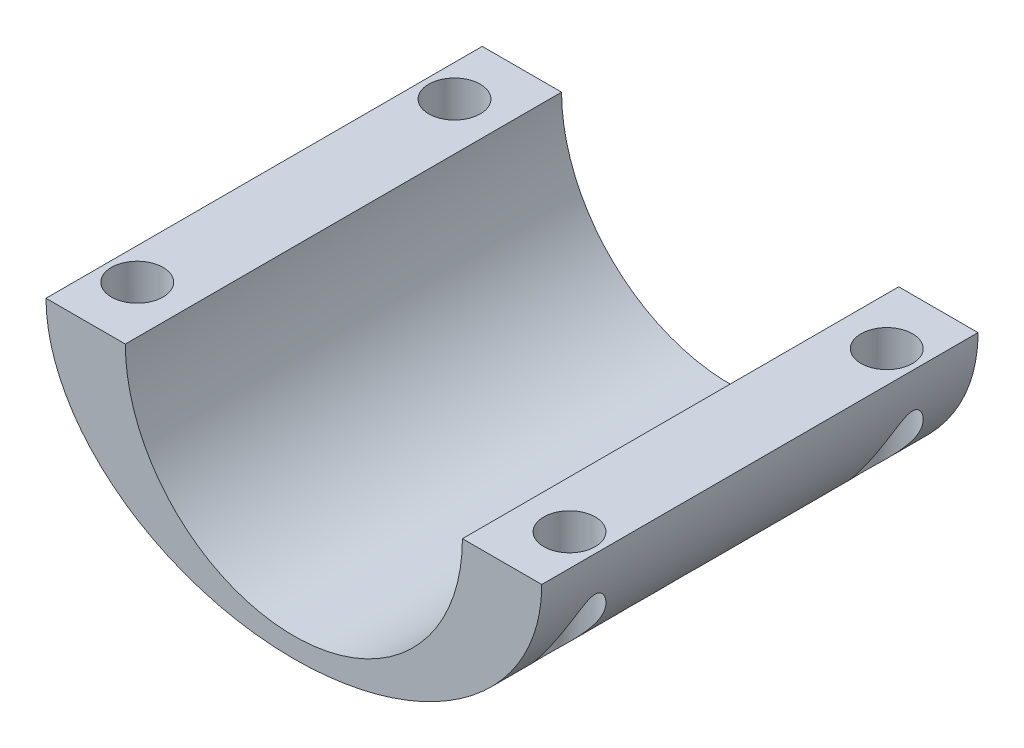
ISO-10303-21;
HEADER;
FILE_DESCRIPTION(('STEP AP214'),'2;1');
FILE_NAME('part.step','',(''),(''),'','','');
FILE_SCHEMA(('AUTOMOTIVE_DESIGN { 1 0 10303 214 1 1 1 1 }'));
ENDSEC;
DATA;
#1=APPLICATION_CONTEXT('core data for automotive mechanical design processes');
#2=APPLICATION_PROTOCOL_DEFINITION('international standard','automotive_design',2000,#1);
#3=PRODUCT_CONTEXT('',#1,'mechanical');
#4=PRODUCT('Part','Part','',(#3));
#5=PRODUCT_RELATED_PRODUCT_CATEGORY('part','',(#4));
#6=PRODUCT_DEFINITION_FORMATION('','',#4);
#7=PRODUCT_DEFINITION_CONTEXT('part definition',#1,'design');
#8=PRODUCT_DEFINITION('design','',#6,#7);
#9=PRODUCT_DEFINITION_SHAPE('','',#8);
#10=(LENGTH_UNIT() NAMED_UNIT(*) SI_UNIT(.MILLI.,.METRE.));
#11=(NAMED_UNIT(*) PLANE_ANGLE_UNIT() SI_UNIT($,.RADIAN.));
#12=(NAMED_UNIT(*) SI_UNIT($,.STERADIAN.) SOLID_ANGLE_UNIT());
#13=UNCERTAINTY_MEASURE_WITH_UNIT(LENGTH_MEASURE(1.E-05),#10,'distance_accuracy_value','');
#14=(GEOMETRIC_REPRESENTATION_CONTEXT(3) GLOBAL_UNCERTAINTY_ASSIGNED_CONTEXT((#13)) GLOBAL_UNIT_ASSIGNED_CONTEXT((#10,
#11,#12)) REPRESENTATION_CONTEXT('',''));
#15=CARTESIAN_POINT('',(0.,0.,0.));
#16=DIRECTION('',(0.,0.,1.));
#17=DIRECTION('',(1.,0.,0.));
#18=AXIS2_PLACEMENT_3D('',#15,#16,#17);
#19=CARTESIAN_POINT('',(0.,0.,22.));
#20=DIRECTION('',(0.,1.,0.));
#21=DIRECTION('',(0.,0.,1.));
#22=AXIS2_PLACEMENT_3D('',#19,#20,#21);
#23=PLANE('',#22);
#24=CARTESIAN_POINT('',(-28.8493906442419,0.,19.));
#25=DIRECTION('',(0.,1.,0.));
#26=DIRECTION('',(0.,0.,1.));
#27=AXIS2_PLACEMENT_3D('',#24,#25,#26);
#28=CIRCLE('',#27,1.3);
#29=CARTESIAN_POINT('',(-28.8493906442419,0.,20.3));
#30=VERTEX_POINT('',#29);
#31=EDGE_CURVE('E158',#30,#30,#28,.T.);
#32=ORIENTED_EDGE('',*,*,#31,.F.);
#33=EDGE_LOOP('',(#32));
#34=FACE_BOUND('',#33,.T.);
#35=CARTESIAN_POINT('',(-28.8493906442419,0.,3.));
#36=DIRECTION('',(0.,1.,0.));
#37=DIRECTION('',(0.,0.,1.));
#38=AXIS2_PLACEMENT_3D('',#35,#36,#37);
#39=CIRCLE('',#38,1.3);
#40=CARTESIAN_POINT('',(-28.8493906442419,0.,4.3));
#41=VERTEX_POINT('',#40);
#42=EDGE_CURVE('E161',#41,#41,#39,.T.);
#43=ORIENTED_EDGE('',*,*,#42,.F.);
#44=EDGE_LOOP('',(#43));
#45=FACE_BOUND('',#44,.T.);
#46=DIRECTION('',(1.,0.,0.));
#47=VECTOR('',#46,1.);
#48=CARTESIAN_POINT('',(0.,0.,0.));
#49=LINE('',#48,#47);
#50=CARTESIAN_POINT('',(-30.4493906442419,0.,0.));
#51=VERTEX_POINT('',#50);
#52=CARTESIAN_POINT('',(-26.4493906442419,0.,0.));
#53=VERTEX_POINT('',#52);
#54=EDGE_CURVE('E115',#51,#53,#49,.T.);
#55=ORIENTED_EDGE('',*,*,#54,.F.);
#56=DIRECTION('',(0.,0.,-1.));
#57=VECTOR('',#56,1.);
#58=CARTESIAN_POINT('',(-30.4493906442419,0.,22.));
#59=LINE('',#58,#57);
#60=CARTESIAN_POINT('',(-30.4493906442419,0.,22.));
#61=VERTEX_POINT('',#60);
#62=EDGE_CURVE('E11',#61,#51,#59,.T.);
#63=ORIENTED_EDGE('',*,*,#62,.F.);
#64=DIRECTION('',(1.,0.,0.));
#65=VECTOR('',#64,1.);
#66=CARTESIAN_POINT('',(0.,0.,22.));
#67=LINE('',#66,#65);
#68=CARTESIAN_POINT('',(-26.4493906442419,0.,22.));
#69=VERTEX_POINT('',#68);
#70=EDGE_CURVE('E96',#61,#69,#67,.T.);
#71=ORIENTED_EDGE('',*,*,#70,.T.);
#72=DIRECTION('',(0.,0.,-1.));
#73=VECTOR('',#72,1.);
#74=CARTESIAN_POINT('',(-26.4493906442419,0.,22.));
#75=LINE('',#74,#73);
#76=EDGE_CURVE('E64',#69,#53,#75,.T.);
#77=ORIENTED_EDGE('',*,*,#76,.T.);
#78=EDGE_LOOP('',(#55,#63,#71,#77));
#79=FACE_BOUND('',#78,.T.);
#80=ADVANCED_FACE('F39',(#34,#45,#79),#23,.T.);
#81=CARTESIAN_POINT('',(-17.9493906442419,0.,22.));
#82=DIRECTION('',(0.,0.,1.));
#83=DIRECTION('',(1.,0.,0.));
#84=AXIS2_PLACEMENT_3D('',#81,#82,#83);
#85=ELLIPSE('',#84,12.5,9.5);
#86=DIRECTION('',(0.,0.,-1.));
#87=VECTOR('',#86,1.);
#88=SURFACE_OF_LINEAR_EXTRUSION('',#85,#87);
#89=CARTESIAN_POINT('',(-28.8493906442419,-4.65030579639662,20.3));
#90=CARTESIAN_POINT('',(-28.7994951925479,-4.71785924405268,20.2999977011807));
#91=CARTESIAN_POINT('',(-28.7486767256658,-4.78471973858606,20.2971320700263));
#92=CARTESIAN_POINT('',(-28.6455664342484,-4.91667710449834,20.2849710510544));
#93=CARTESIAN_POINT('',(-28.5932753903262,-4.98177487568791,20.2756790105446));
#94=CARTESIAN_POINT('',(-28.4878958148666,-5.10953584726912,20.2499016784222));
#95=CARTESIAN_POINT('',(-28.4348104335398,-5.17220628311839,20.2334399016081));
#96=CARTESIAN_POINT('',(-28.3283806063749,-5.29474608826117,20.1923941587364));
#97=CARTESIAN_POINT('',(-28.2750359845292,-5.35461313085704,20.1678035778915));
#98=CARTESIAN_POINT('',(-28.1663351649589,-5.47377410985166,20.1079228155664));
#99=CARTESIAN_POINT('',(-28.1110264417735,-5.53286150078276,20.0721253918946));
#100=CARTESIAN_POINT('',(-28.0032935634344,-5.64539238964488,19.9893019054669));
#101=CARTESIAN_POINT('',(-27.9508626873453,-5.69884933121735,19.9423035055118));
#102=CARTESIAN_POINT('',(-27.8600869882895,-5.78961970439812,19.8455035485493));
#103=CARTESIAN_POINT('',(-27.8208834387897,-5.82812074748685,19.7976347422741));
#104=CARTESIAN_POINT('',(-27.7480488032184,-5.89868569198814,19.6935872635683));
#105=CARTESIAN_POINT('',(-27.7144111016881,-5.93075724510596,19.6374186087739));
#106=CARTESIAN_POINT('',(-27.6603585491034,-5.98176570162834,19.5283937988321));
#107=CARTESIAN_POINT('',(-27.6386508442594,-6.00203153970664,19.4768044128342));
#108=CARTESIAN_POINT('',(-27.6016852221498,-6.03633628422827,19.3693912481441));
#109=CARTESIAN_POINT('',(-27.5864240247481,-6.0503783576505,19.3135696400033));
#110=CARTESIAN_POINT('',(-27.5633448697395,-6.07154960360121,19.1988129106279));
#111=CARTESIAN_POINT('',(-27.5555645348572,-6.07864383736306,19.1398636089601));
#112=CARTESIAN_POINT('',(-27.5481999383769,-6.08536024909122,19.0210330366121));
#113=CARTESIAN_POINT('',(-27.5486134221667,-6.08498448250374,18.9611520268321));
#114=CARTESIAN_POINT('',(-27.5572072254848,-6.07714430049821,18.847590007452));
#115=CARTESIAN_POINT('',(-27.56472542385,-6.0702841793339,18.7938141073709));
#116=CARTESIAN_POINT('',(-27.5860825626794,-6.05069056393578,18.6886609632107));
#117=CARTESIAN_POINT('',(-27.5999216447928,-6.03795693807845,18.6372837729144));
#118=CARTESIAN_POINT('',(-27.6336203544647,-6.00671307240427,18.5365213786718));
#119=CARTESIAN_POINT('',(-27.6536518669454,-5.98803739779557,18.4872458481338));
#120=CARTESIAN_POINT('',(-27.6985129052574,-5.94579882997501,18.3932047197666));
#121=CARTESIAN_POINT('',(-27.7233448549237,-5.92223346742105,18.3484414176954));
#122=CARTESIAN_POINT('',(-27.7884827771301,-5.85969704898539,18.2452469562648));
#123=CARTESIAN_POINT('',(-27.8308000628062,-5.81850121559906,18.189426798701));
#124=CARTESIAN_POINT('',(-27.9204518807535,-5.72948331185859,18.0880374165942));
#125=CARTESIAN_POINT('',(-27.9677967404896,-5.68164753759415,18.0424899172251));
#126=CARTESIAN_POINT('',(-28.0845870744138,-5.56104448220321,17.9450477666648));
#127=CARTESIAN_POINT('',(-28.1553796813678,-5.48588915940195,17.8977440683646));
#128=CARTESIAN_POINT('',(-28.2984539735726,-5.32882865610345,17.8196903934515));
#129=CARTESIAN_POINT('',(-28.3707375903754,-5.24691424604473,17.7889634986913));
#130=CARTESIAN_POINT('',(-28.4958964471461,-5.09998477515047,17.7477237745662));
#131=CARTESIAN_POINT('',(-28.5490031096739,-5.03601174231094,17.7340498768014));
#132=CARTESIAN_POINT('',(-28.6540406675421,-4.90600836139019,17.7136483543687));
#133=CARTESIAN_POINT('',(-28.7059709918134,-4.83997704954532,17.7069240356567));
#134=CARTESIAN_POINT('',(-28.8594789172737,-4.63919873504235,17.6959836789825));
#135=CARTESIAN_POINT('',(-28.9585850373043,-4.50198759771029,17.7010556004959));
#136=CARTESIAN_POINT('',(-29.1211682031177,-4.26301427673059,17.7268655432649));
#137=CARTESIAN_POINT('',(-29.1868352962561,-4.16211738284284,17.7428044118707));
#138=CARTESIAN_POINT('',(-29.3132139117692,-3.95896141314336,17.7837425923732));
#139=CARTESIAN_POINT('',(-29.3739225030717,-3.85670157261411,17.808747216405));
#140=CARTESIAN_POINT('',(-29.4899213297535,-3.65177158750455,17.8668971135774));
#141=CARTESIAN_POINT('',(-29.545223176806,-3.54910283804674,17.9000243801));
#142=CARTESIAN_POINT('',(-29.6503650468964,-3.34384103060416,17.9740478243799));
#143=CARTESIAN_POINT('',(-29.7002084365425,-3.24124796517125,18.0149391704548));
#144=CARTESIAN_POINT('',(-29.7836454987149,-3.06012708950107,18.0946285250315));
#145=CARTESIAN_POINT('',(-29.818365384936,-2.98140207163156,18.1318099619629));
#146=CARTESIAN_POINT('',(-29.8843961392908,-2.82504392795576,18.211668599633));
#147=CARTESIAN_POINT('',(-29.9157002717235,-2.74741321337174,18.2543563094326));
#148=CARTESIAN_POINT('',(-29.9599516495148,-2.63263189104297,18.3236801552419));
#149=CARTESIAN_POINT('',(-29.974306723828,-2.59448966340552,18.3477845685133));
#150=CARTESIAN_POINT('',(-30.0019878426736,-2.51920660018803,18.3980490664109));
#151=CARTESIAN_POINT('',(-30.0153142767962,-2.48206538898337,18.4242083651144));
#152=CARTESIAN_POINT('',(-30.0407823488083,-2.40941386070786,18.4789487071254));
#153=CARTESIAN_POINT('',(-30.0529283554117,-2.37389780928074,18.5075200273835));
#154=CARTESIAN_POINT('',(-30.0759040138486,-2.30517380582275,18.5678980420302));
#155=CARTESIAN_POINT('',(-30.0867333888125,-2.27196633988243,18.5997054143423));
#156=CARTESIAN_POINT('',(-30.1040393326852,-2.21777969307264,18.6586298179002));
#157=CARTESIAN_POINT('',(-30.1109110943771,-2.19588349763783,18.6847755118588));
#158=CARTESIAN_POINT('',(-30.1234142021389,-2.15549302487081,18.7398840777231));
#159=CARTESIAN_POINT('',(-30.1290476605488,-2.13699296332907,18.7688420287537));
#160=CARTESIAN_POINT('',(-30.1370795624141,-2.11034597025084,18.8202678000099));
#161=CARTESIAN_POINT('',(-30.1399381848682,-2.10077293495962,18.8419115250639));
#162=CARTESIAN_POINT('',(-30.1446173193291,-2.08502777479455,18.8864789795059));
#163=CARTESIAN_POINT('',(-30.1464408781079,-2.07884567033858,18.9093987318106));
#164=CARTESIAN_POINT('',(-30.1488705042093,-2.07059560686988,18.9563198723245));
#165=CARTESIAN_POINT('',(-30.1494630880744,-2.06857321350528,18.980330325484));
#166=CARTESIAN_POINT('',(-30.1493038859281,-2.0691154505245,19.0282972513564));
#167=CARTESIAN_POINT('',(-30.1485519527826,-2.07168058293346,19.0522537178742));
#168=CARTESIAN_POINT('',(-30.1459880640911,-2.08037947654995,19.0962216485332));
#169=CARTESIAN_POINT('',(-30.1443239855966,-2.0860148494708,19.1163457892029));
#170=CARTESIAN_POINT('',(-30.1401992059993,-2.09989459103786,19.1555711293442));
#171=CARTESIAN_POINT('',(-30.1377382095697,-2.10813992687561,19.1746719465229));
#172=CARTESIAN_POINT('',(-30.1298311122126,-2.1344214690783,19.2272957717266));
#173=CARTESIAN_POINT('',(-30.1236121317343,-2.15487070957593,19.2594846906795));
#174=CARTESIAN_POINT('',(-30.1096595898968,-2.19990776718585,19.32047934107));
#175=CARTESIAN_POINT('',(-30.1019196872531,-2.22451284903466,19.3492700708984));
#176=CARTESIAN_POINT('',(-30.0821073430822,-2.28626588410568,19.4147182330916));
#177=CARTESIAN_POINT('',(-30.0695181059861,-2.32458010837796,19.4501020453028));
#178=CARTESIAN_POINT('',(-30.042693267457,-2.40392732737803,19.517035590637));
#179=CARTESIAN_POINT('',(-30.0284542614348,-2.44496586696059,19.5485771092961));
#180=CARTESIAN_POINT('',(-29.9985070115632,-2.52888028916676,19.6088242771362));
#181=CARTESIAN_POINT('',(-29.982791781043,-2.57176432873134,19.6375149668465));
#182=CARTESIAN_POINT('',(-29.9500971221366,-2.65854171031797,19.6924335919279));
#183=CARTESIAN_POINT('',(-29.9331187751573,-2.70243416723416,19.718663591467));
#184=CARTESIAN_POINT('',(-29.8964398737271,-2.79473164130408,19.7712340128863));
#185=CARTESIAN_POINT('',(-29.8766308466121,-2.84319913071929,19.7973885186496));
#186=CARTESIAN_POINT('',(-29.8356471603017,-2.94066421897315,19.8475525034484));
#187=CARTESIAN_POINT('',(-29.8144723138909,-2.98966188971538,19.8715616873403));
#188=CARTESIAN_POINT('',(-29.7489122270596,-3.13723940026509,19.9406954101518));
#189=CARTESIAN_POINT('',(-29.7025233695538,-3.23632298229117,19.9828812532777));
#190=CARTESIAN_POINT('',(-29.6047934120918,-3.4344021089539,20.0598163961644));
#191=CARTESIAN_POINT('',(-29.5534710409747,-3.53339665066281,20.0945923246262));
#192=CARTESIAN_POINT('',(-29.4458716378941,-3.73102920759214,20.1567495151428));
#193=CARTESIAN_POINT('',(-29.3895942848439,-3.82966719927601,20.1841302975179));
#194=CARTESIAN_POINT('',(-29.2577144399126,-4.05039064559699,20.2367255990279));
#195=CARTESIAN_POINT('',(-29.1807810637077,-4.17222305255903,20.2597179997689));
#196=CARTESIAN_POINT('',(-29.0199632395754,-4.41350490607807,20.2913666986345));
#197=CARTESIAN_POINT('',(-28.9360697317684,-4.53295098742514,20.3000039935416));
#198=CARTESIAN_POINT('',(-28.8493906442419,-4.65030579639662,20.3));
#199=B_SPLINE_CURVE_WITH_KNOTS('',3,(#89,#90,#91,#92,#93,#94,#95,#96,#97,#98,#99,#100,#101,#102,
#103,#104,#105,#106,#107,#108,#109,#110,#111,#112,#113,#114,#115,#116,#117,#118,#119,#120,#121,
#122,#123,#124,#125,#126,#127,#128,#129,#130,#131,#132,#133,#134,#135,#136,#137,#138,#139,#140,
#141,#142,#143,#144,#145,#146,#147,#148,#149,#150,#151,#152,#153,#154,#155,#156,#157,#158,#159,
#160,#161,#162,#163,#164,#165,#166,#167,#168,#169,#170,#171,#172,#173,#174,#175,#176,#177,#178,
#179,#180,#181,#182,#183,#184,#185,#186,#187,#188,#189,#190,#191,#192,#193,#194,#195,#196,#197,
#198),.UNSPECIFIED.,.T.,.F.,(4,2,2,2,2,2,2,2,2,2,2,2,2,2,2,2,2,2,2,2,2,2,2,2,2,2,2,2,2,2,2,2,2,
2,2,2,2,2,2,2,2,2,2,2,2,2,2,2,2,2,2,2,2,2,4),(0.,0.251861362234591,0.503591636773151,
0.754502448870518,1.00561794350861,1.27033021329092,1.53439538273568,1.75220976660732,
1.96976337134718,2.14760669701626,2.32535942245558,2.50400149644785,2.68259441594546,
2.84603080327365,3.00947085334113,3.17793159089271,3.34647761079468,3.58891240891867,
3.83185521137788,4.17069094952827,4.50999727912576,4.76244229107335,5.01500733741025,
5.52101238740684,5.88492581541137,6.24905282627019,6.61237980951388,6.97548142660418,
7.2564977241501,7.53805852196534,7.68005683241943,7.82200109540436,7.96339824603935,
8.10482507932751,8.20900018285502,8.31299617760306,8.38427653605185,8.45534597364701,
8.52718985011434,8.59904158912928,8.66170350474353,8.72438866864506,8.83962697812693,
8.95535636282459,9.11592174486892,9.27682459058614,9.4385315208683,9.60010156589914,
9.77561849490674,9.95115953367112,10.3025339316219,10.6526234795604,11.0027357303007,
11.4396948819149,11.8772320184772),.UNSPECIFIED.);
#200=CARTESIAN_POINT('',(-28.8493906442419,-4.65030579639662,20.3));
#201=VERTEX_POINT('',#200);
#202=EDGE_CURVE('E45',#201,#201,#199,.T.);
#203=ORIENTED_EDGE('',*,*,#202,.T.);
#204=EDGE_LOOP('',(#203));
#205=FACE_BOUND('',#204,.T.);
#206=CARTESIAN_POINT('',(-7.04939064424193,-4.65030579639662,4.3));
#207=CARTESIAN_POINT('',(-6.98632999549776,-4.5649282423126,4.30000180002264));
#208=CARTESIAN_POINT('',(-6.92473541650233,-4.47843953005143,4.29542151307086));
#209=CARTESIAN_POINT('',(-6.80498046814374,-4.30383777291481,4.27825110217791));
#210=CARTESIAN_POINT('',(-6.74682311921507,-4.2157233861402,4.26565404466537));
#211=CARTESIAN_POINT('',(-6.63387807955282,-4.03775309322998,4.23321793385045));
#212=CARTESIAN_POINT('',(-6.57911830767214,-3.94788914602446,4.21332631560007));
#213=CARTESIAN_POINT('',(-6.47366809646005,-3.76753404730194,4.16698767654649));
#214=CARTESIAN_POINT('',(-6.42297571775129,-3.67704321731932,4.14054380481531));
#215=CARTESIAN_POINT('',(-6.33958694166831,-3.52159400429334,4.08987813761615));
#216=CARTESIAN_POINT('',(-6.30586970512184,-3.45668632826739,4.06715975868737));
#217=CARTESIAN_POINT('',(-6.24060475992789,-3.32691572780227,4.01858795536905));
#218=CARTESIAN_POINT('',(-6.20905786211089,-3.26205282895474,3.99273336916498));
#219=CARTESIAN_POINT('',(-6.14815226807901,-3.13254342654935,3.93779244168574));
#220=CARTESIAN_POINT('',(-6.11879657275353,-3.06789733150027,3.90870179951294));
#221=CARTESIAN_POINT('',(-6.06263891739524,-2.93982978986389,3.84736916341514));
#222=CARTESIAN_POINT('',(-6.03581600238406,-2.87640254915905,3.81515852403371));
#223=CARTESIAN_POINT('',(-5.9845366276601,-2.75071078387964,3.74693439930894));
#224=CARTESIAN_POINT('',(-5.96007769331357,-2.68844509972716,3.71092497502197));
#225=CARTESIAN_POINT('',(-5.925305535164,-2.59661392217116,3.65339901657489));
#226=CARTESIAN_POINT('',(-5.91404354855268,-2.56629157760657,3.63365790658267));
#227=CARTESIAN_POINT('',(-5.89218929624115,-2.50633748847144,3.5928092285187));
#228=CARTESIAN_POINT('',(-5.88159685637545,-2.47670556558216,3.57170201871834));
#229=CARTESIAN_POINT('',(-5.8652833023673,-2.43020719916153,3.5367462271792));
#230=CARTESIAN_POINT('',(-5.85932671748283,-2.41303108606098,3.52341998788935));
#231=CARTESIAN_POINT('',(-5.84769125921358,-2.37910417410551,3.49612317468356));
#232=CARTESIAN_POINT('',(-5.84201239622392,-2.36235339118193,3.48215257668727));
#233=CARTESIAN_POINT('',(-5.82537936569639,-2.31274369898452,3.43903698538661));
#234=CARTESIAN_POINT('',(-5.8148748524687,-2.28065929210712,3.40878506462));
#235=CARTESIAN_POINT('',(-5.80019671597053,-2.23490754776744,3.36028223581566));
#236=CARTESIAN_POINT('',(-5.7954491920317,-2.21993935939595,3.34344144437826));
#237=CARTESIAN_POINT('',(-5.78643016848351,-2.19122271998567,3.30863576506098));
#238=CARTESIAN_POINT('',(-5.78215892903947,-2.1774749364079,3.29067027110883));
#239=CARTESIAN_POINT('',(-5.77026063800963,-2.13882631095519,3.23505722141104));
#240=CARTESIAN_POINT('',(-5.76345819103366,-2.11623411540802,3.19541001388647));
#241=CARTESIAN_POINT('',(-5.75603577599476,-2.09134352532336,3.13286218016161));
#242=CARTESIAN_POINT('',(-5.75403790251678,-2.08459266237138,3.11190700343142));
#243=CARTESIAN_POINT('',(-5.75105331839289,-2.07448155092782,3.06912293417289));
#244=CARTESIAN_POINT('',(-5.75006516568073,-2.07111646702921,3.04729533408474));
#245=CARTESIAN_POINT('',(-5.74920755925497,-2.06819699403146,3.00325396841729));
#246=CARTESIAN_POINT('',(-5.74934330769914,-2.06866032534993,2.98103888257968));
#247=CARTESIAN_POINT('',(-5.75072878717464,-2.07337381750339,2.9370432904372));
#248=CARTESIAN_POINT('',(-5.75197974220385,-2.07762813914739,2.91526328852106));
#249=CARTESIAN_POINT('',(-5.7558969414902,-2.09087145575484,2.86738431302707));
#250=CARTESIAN_POINT('',(-5.75883890336264,-2.10077848805116,2.8415675125435));
#251=CARTESIAN_POINT('',(-5.76591508292247,-2.12435626332257,2.79184895904244));
#252=CARTESIAN_POINT('',(-5.77005385240302,-2.13804136617978,2.76795497105387));
#253=CARTESIAN_POINT('',(-5.77877441764623,-2.166524547182,2.72435903021349));
#254=CARTESIAN_POINT('',(-5.78327177825815,-2.18107827835389,2.70447625575754));
#255=CARTESIAN_POINT('',(-5.79284267869909,-2.21168741653406,2.66611762908596));
#256=CARTESIAN_POINT('',(-5.79791535326976,-2.22774056220759,2.6476397320895));
#257=CARTESIAN_POINT('',(-5.80856135316916,-2.26101902678798,2.611807856463));
#258=CARTESIAN_POINT('',(-5.8141364116357,-2.2782483495858,2.5944581540357));
#259=CARTESIAN_POINT('',(-5.8257053210953,-2.31355137405921,2.56078373801327));
#260=CARTESIAN_POINT('',(-5.83169931031645,-2.33162535377516,2.54445936613606));
#261=CARTESIAN_POINT('',(-5.84730160348482,-2.3780700779139,2.50436034144481));
#262=CARTESIAN_POINT('',(-5.85715538104197,-2.40686515051543,2.4811735093083));
#263=CARTESIAN_POINT('',(-5.87761779157756,-2.46548244865926,2.43648383296337));
#264=CARTESIAN_POINT('',(-5.88822679156091,-2.49530516991133,2.41498181831191));
#265=CARTESIAN_POINT('',(-5.92111096335712,-2.58592970205741,2.35253568817129));
#266=CARTESIAN_POINT('',(-5.94441979870243,-2.64781734179845,2.31370944740206));
#267=CARTESIAN_POINT('',(-5.9936035637585,-2.77339003199805,2.24021823654104));
#268=CARTESIAN_POINT('',(-6.0194895357072,-2.83708190010206,2.20557271489321));
#269=CARTESIAN_POINT('',(-6.07359343930833,-2.96529426665287,2.13998650946244));
#270=CARTESIAN_POINT('',(-6.10180957447498,-3.02981409494348,2.10904301577688));
#271=CARTESIAN_POINT('',(-6.17984169490699,-3.20193875476712,2.03117447602097));
#272=CARTESIAN_POINT('',(-6.23165269033397,-3.30995573861058,1.98713277185718));
#273=CARTESIAN_POINT('',(-6.34135075857652,-3.52616244122791,1.9076351815954));
#274=CARTESIAN_POINT('',(-6.39924274908027,-3.63435222903312,1.87218632233616));
#275=CARTESIAN_POINT('',(-6.52067077458743,-3.84968527036046,1.81042919291023));
#276=CARTESIAN_POINT('',(-6.58418703579775,-3.95683082701721,1.7840903801223));
#277=CARTESIAN_POINT('',(-6.71667339417825,-4.1696261336615,1.74137485341225));
#278=CARTESIAN_POINT('',(-6.78563916863996,-4.27527699238297,1.72499033135212));
#279=CARTESIAN_POINT('',(-6.94489625230154,-4.50823567437938,1.70116609738026));
#280=CARTESIAN_POINT('',(-7.03646604064111,-4.63499273241991,1.69661530514794));
#281=CARTESIAN_POINT('',(-7.22546697418677,-4.88313261011206,1.70850867998534));
#282=CARTESIAN_POINT('',(-7.32289089638912,-5.00452174425345,1.72492746121964));
#283=CARTESIAN_POINT('',(-7.49263479095881,-5.2060684748889,1.77565039324668));
#284=CARTESIAN_POINT('',(-7.56436964990072,-5.28827559934705,1.80368135305871));
#285=CARTESIAN_POINT('',(-7.70684703512104,-5.44640032171913,1.87567320660975));
#286=CARTESIAN_POINT('',(-7.77759090573946,-5.52232730328375,1.91960978628303));
#287=CARTESIAN_POINT('',(-7.89554191923815,-5.64538465555731,2.01109069531454));
#288=CARTESIAN_POINT('',(-7.94384332006964,-5.69466816592806,2.05426927438001));
#289=CARTESIAN_POINT('',(-8.01290919693156,-5.7638769902179,2.1266488663198));
#290=CARTESIAN_POINT('',(-8.03535529847777,-5.78614950141279,2.152027871402));
#291=CARTESIAN_POINT('',(-8.0788560994448,-5.8289480339529,2.2054005235785));
#292=CARTESIAN_POINT('',(-8.09990904884617,-5.84947186764682,2.23339735646525));
#293=CARTESIAN_POINT('',(-8.15220725791121,-5.90006235651676,2.3093488671848));
#294=CARTESIAN_POINT('',(-8.18210777310922,-5.92858520542176,2.359306446422));
#295=CARTESIAN_POINT('',(-8.23580677273631,-5.97932779153748,2.46526982059468));
#296=CARTESIAN_POINT('',(-8.25961464406782,-6.0015572306561,2.52126612016296));
#297=CARTESIAN_POINT('',(-8.29975469735689,-6.03879888529537,2.63878946377903));
#298=CARTESIAN_POINT('',(-8.31602053637013,-6.05374710796642,2.70036009932134));
#299=CARTESIAN_POINT('',(-8.33937408522441,-6.07514976603742,2.82664065863458));
#300=CARTESIAN_POINT('',(-8.34646961787584,-6.08161144103785,2.89134785777181));
#301=CARTESIAN_POINT('',(-8.35055188670499,-6.08533164977659,3.01262560688733));
#302=CARTESIAN_POINT('',(-8.3487646821279,-6.08370636621014,3.06912583133864));
#303=CARTESIAN_POINT('',(-8.33797338597145,-6.07385652789917,3.18083358046518));
#304=CARTESIAN_POINT('',(-8.32897042553939,-6.06563300749898,3.23604130635748));
#305=CARTESIAN_POINT('',(-8.304736336718,-6.04336149626914,3.34202033247288));
#306=CARTESIAN_POINT('',(-8.28969784046292,-6.02949347924231,3.39287464734296));
#307=CARTESIAN_POINT('',(-8.25427678419043,-5.99656600509498,3.49088411489643));
#308=CARTESIAN_POINT('',(-8.23389301446263,-5.97750537277476,3.53803842707475));
#309=CARTESIAN_POINT('',(-8.18636487371249,-5.93262191128454,3.63276262040699));
#310=CARTESIAN_POINT('',(-8.15873287510566,-5.90629641447848,3.67984658504399));
#311=CARTESIAN_POINT('',(-8.09938563352328,-5.8490234684062,3.76834635245058));
#312=CARTESIAN_POINT('',(-8.06766442794353,-5.81806925910762,3.80975369233779));
#313=CARTESIAN_POINT('',(-8.0085589000458,-5.75956068520405,3.8783947628573));
#314=CARTESIAN_POINT('',(-7.98173616336631,-5.73273569865129,3.90675069904589));
#315=CARTESIAN_POINT('',(-7.92679815260988,-5.67714068115195,3.96000959104751));
#316=CARTESIAN_POINT('',(-7.8986839625249,-5.64837227222054,3.98491537472134));
#317=CARTESIAN_POINT('',(-7.81281633469312,-5.55939928877115,4.05481721976414));
#318=CARTESIAN_POINT('',(-7.75365388766336,-5.49664089601682,4.09486817962709));
#319=CARTESIAN_POINT('',(-7.60734798689348,-5.33707217707013,4.17840295897653));
#320=CARTESIAN_POINT('',(-7.51951554851747,-5.23757796988276,4.21542218698398));
#321=CARTESIAN_POINT('',(-7.34573666420171,-5.03200635034627,4.26903395517025));
#322=CARTESIAN_POINT('',(-7.25979026397547,-4.92592877866852,4.28562600077382));
#323=CARTESIAN_POINT('',(-7.13320940853742,-4.76244094400361,4.29800449734072));
#324=CARTESIAN_POINT('',(-7.09098116894083,-4.70661503746181,4.29999881282721));
#325=CARTESIAN_POINT('',(-7.04939064424193,-4.65030579639662,4.3));
#326=B_SPLINE_CURVE_WITH_KNOTS('',3,(#206,#207,#208,#209,#210,#211,#212,#213,#214,#215,#216,
#217,#218,#219,#220,#221,#222,#223,#224,#225,#226,#227,#228,#229,#230,#231,#232,#233,#234,#235,
#236,#237,#238,#239,#240,#241,#242,#243,#244,#245,#246,#247,#248,#249,#250,#251,#252,#253,#254,
#255,#256,#257,#258,#259,#260,#261,#262,#263,#264,#265,#266,#267,#268,#269,#270,#271,#272,#273,
#274,#275,#276,#277,#278,#279,#280,#281,#282,#283,#284,#285,#286,#287,#288,#289,#290,#291,#292,
#293,#294,#295,#296,#297,#298,#299,#300,#301,#302,#303,#304,#305,#306,#307,#308,#309,#310,#311,
#312,#313,#314,#315,#316,#317,#318,#319,#320,#321,#322,#323,#324,#325),.UNSPECIFIED.,.T.,.F.,(4,
2,2,2,2,2,2,2,2,2,2,2,2,2,2,2,2,2,2,2,2,2,2,2,2,2,2,2,2,2,2,2,2,2,2,2,2,2,2,2,2,2,2,2,2,2,2,2,2,
2,2,2,2,2,2,2,2,2,2,4),(0.,0.318377075634942,0.6370298852155,0.958025551716213,1.27886724303475,
1.50854905938532,1.73831622319685,1.96839249350152,2.19635831207598,2.42408284918362,
2.53773890881463,2.65136528101347,2.71897324127179,2.78658373015931,2.9223135215678,
2.99132760737687,3.06037920861277,3.19725530425184,3.26333164762907,3.32931348942505,
3.39560090896292,3.46196117212385,3.54491822358335,3.62819502961757,3.70322667535334,
3.77814693542836,3.85333634947283,3.92855069080412,4.04325111115383,4.15800765646241,
4.38780241029163,4.61862800488008,4.84927727216834,5.23171039324698,5.61445520365488,
5.9959040828103,6.377053366143,6.84505290236321,7.312486413452,7.64941752556651,
7.98583574915139,8.22912399270962,8.35063370288136,8.47229325939157,8.66597767835867,
8.85936186743682,9.05441630107173,9.24930423174103,9.41810358447421,9.58687648126843,
9.75064395760472,9.91444852885332,10.0956187946957,10.2770562837657,10.4189498121206,
10.5607263428108,10.8448953584651,11.2560575260372,11.6672296483172,11.877209562756),.UNSPECIFIED.);
#327=CARTESIAN_POINT('',(-7.04939064424193,-4.65030579639662,4.3));
#328=VERTEX_POINT('',#327);
#329=EDGE_CURVE('E125',#328,#328,#326,.T.);
#330=ORIENTED_EDGE('',*,*,#329,.T.);
#331=EDGE_LOOP('',(#330));
#332=FACE_BOUND('',#331,.T.);
#333=CARTESIAN_POINT('',(-7.04939064424193,-4.65030579639662,20.3));
#334=CARTESIAN_POINT('',(-6.98632999549776,-4.5649282423126,20.3000018000226));
#335=CARTESIAN_POINT('',(-6.92473541650233,-4.47843953005143,20.2954215130709));
#336=CARTESIAN_POINT('',(-6.80498046814374,-4.30383777291481,20.2782511021779));
#337=CARTESIAN_POINT('',(-6.74682311921507,-4.2157233861402,20.2656540446654));
#338=CARTESIAN_POINT('',(-6.63387807955282,-4.03775309322998,20.2332179338505));
#339=CARTESIAN_POINT('',(-6.57911830767214,-3.94788914602446,20.2133263156001));
#340=CARTESIAN_POINT('',(-6.47366809646005,-3.76753404730194,20.1669876765465));
#341=CARTESIAN_POINT('',(-6.42297571775129,-3.67704321731932,20.1405438048153));
#342=CARTESIAN_POINT('',(-6.33958694166831,-3.52159400429334,20.0898781376161));
#343=CARTESIAN_POINT('',(-6.30586970512184,-3.45668632826739,20.0671597586874));
#344=CARTESIAN_POINT('',(-6.24060475992789,-3.32691572780227,20.018587955369));
#345=CARTESIAN_POINT('',(-6.20905786211089,-3.26205282895474,19.992733369165));
#346=CARTESIAN_POINT('',(-6.14815226807901,-3.13254342654935,19.9377924416857));
#347=CARTESIAN_POINT('',(-6.11879657275353,-3.06789733150027,19.9087017995129));
#348=CARTESIAN_POINT('',(-6.06263891739524,-2.93982978986389,19.8473691634151));
#349=CARTESIAN_POINT('',(-6.03581600238407,-2.87640254915905,19.8151585240337));
#350=CARTESIAN_POINT('',(-5.9845366276601,-2.75071078387964,19.7469343993089));
#351=CARTESIAN_POINT('',(-5.96007769331357,-2.68844509972716,19.710924975022));
#352=CARTESIAN_POINT('',(-5.925305535164,-2.59661392217116,19.6533990165749));
#353=CARTESIAN_POINT('',(-5.91404354855268,-2.56629157760657,19.6336579065827));
#354=CARTESIAN_POINT('',(-5.89218929624115,-2.50633748847144,19.5928092285187));
#355=CARTESIAN_POINT('',(-5.88159685637545,-2.47670556558216,19.5717020187183));
#356=CARTESIAN_POINT('',(-5.8652833023673,-2.43020719916153,19.5367462271792));
#357=CARTESIAN_POINT('',(-5.85932671748283,-2.41303108606098,19.5234199878893));
#358=CARTESIAN_POINT('',(-5.84769125921358,-2.3791041741055,19.4961231746836));
#359=CARTESIAN_POINT('',(-5.84201239622392,-2.36235339118193,19.4821525766873));
#360=CARTESIAN_POINT('',(-5.82537936569639,-2.31274369898451,19.4390369853866));
#361=CARTESIAN_POINT('',(-5.81487485246869,-2.28065929210711,19.40878506462));
#362=CARTESIAN_POINT('',(-5.80019671597053,-2.23490754776743,19.3602822358157));
#363=CARTESIAN_POINT('',(-5.7954491920317,-2.21993935939595,19.3434414443783));
#364=CARTESIAN_POINT('',(-5.78643016848351,-2.19122271998566,19.308635765061));
#365=CARTESIAN_POINT('',(-5.78215892903947,-2.1774749364079,19.2906702711088));
#366=CARTESIAN_POINT('',(-5.77026063800963,-2.13882631095519,19.235057221411));
#367=CARTESIAN_POINT('',(-5.76345819103366,-2.11623411540802,19.1954100138865));
#368=CARTESIAN_POINT('',(-5.75603577599476,-2.09134352532336,19.1328621801616));
#369=CARTESIAN_POINT('',(-5.75403790251678,-2.08459266237138,19.1119070034314));
#370=CARTESIAN_POINT('',(-5.75105331839289,-2.07448155092782,19.0691229341729));
#371=CARTESIAN_POINT('',(-5.75006516568073,-2.07111646702921,19.0472953340847));
#372=CARTESIAN_POINT('',(-5.74920755925497,-2.06819699403146,19.0032539684173));
#373=CARTESIAN_POINT('',(-5.74934330769914,-2.06866032534993,18.9810388825797));
#374=CARTESIAN_POINT('',(-5.75072878717464,-2.07337381750339,18.9370432904372));
#375=CARTESIAN_POINT('',(-5.75197974220385,-2.0776281391474,18.9152632885211));
#376=CARTESIAN_POINT('',(-5.7558969414902,-2.09087145575485,18.8673843130271));
#377=CARTESIAN_POINT('',(-5.75883890336264,-2.10077848805116,18.8415675125435));
#378=CARTESIAN_POINT('',(-5.76591508292247,-2.12435626332258,18.7918489590424));
#379=CARTESIAN_POINT('',(-5.77005385240302,-2.13804136617979,18.7679549710539));
#380=CARTESIAN_POINT('',(-5.77877441764624,-2.16652454718201,18.7243590302135));
#381=CARTESIAN_POINT('',(-5.78327177825815,-2.1810782783539,18.7044762557575));
#382=CARTESIAN_POINT('',(-5.79284267869909,-2.21168741653408,18.6661176290859));
#383=CARTESIAN_POINT('',(-5.79791535326976,-2.22774056220761,18.6476397320895));
#384=CARTESIAN_POINT('',(-5.80856135316917,-2.261019026788,18.611807856463));
#385=CARTESIAN_POINT('',(-5.81413641163571,-2.27824834958582,18.5944581540357));
#386=CARTESIAN_POINT('',(-5.82570532109531,-2.31355137405924,18.5607837380132));
#387=CARTESIAN_POINT('',(-5.83169931031646,-2.33162535377519,18.544459366136));
#388=CARTESIAN_POINT('',(-5.84730160348484,-2.37807007791394,18.5043603414448));
#389=CARTESIAN_POINT('',(-5.85715538104198,-2.40686515051547,18.4811735093083));
#390=CARTESIAN_POINT('',(-5.87761779157758,-2.46548244865931,18.4364838329633));
#391=CARTESIAN_POINT('',(-5.88822679156093,-2.49530516991138,18.4149818183119));
#392=CARTESIAN_POINT('',(-5.92111096335714,-2.58592970205746,18.3525356881713));
#393=CARTESIAN_POINT('',(-5.94441979870245,-2.64781734179851,18.313709447402));
#394=CARTESIAN_POINT('',(-5.99360356375852,-2.77339003199812,18.240218236541));
#395=CARTESIAN_POINT('',(-6.01948953570723,-2.83708190010213,18.2055727148932));
#396=CARTESIAN_POINT('',(-6.07359343930837,-2.96529426665295,18.1399865094624));
#397=CARTESIAN_POINT('',(-6.10180957447502,-3.02981409494357,18.1090430157768));
#398=CARTESIAN_POINT('',(-6.17984169490704,-3.20193875476721,18.0311744760209));
#399=CARTESIAN_POINT('',(-6.23165269033402,-3.30995573861068,17.9871327718571));
#400=CARTESIAN_POINT('',(-6.34135075857657,-3.52616244122801,17.9076351815954));
#401=CARTESIAN_POINT('',(-6.39924274908032,-3.63435222903321,17.8721863223361));
#402=CARTESIAN_POINT('',(-6.52067077458749,-3.84968527036056,17.8104291929102));
#403=CARTESIAN_POINT('',(-6.58418703579781,-3.9568308270173,17.7840903801223));
#404=CARTESIAN_POINT('',(-6.71667339417831,-4.16962613366159,17.7413748534122));
#405=CARTESIAN_POINT('',(-6.78563916864001,-4.27527699238306,17.7249903313521));
#406=CARTESIAN_POINT('',(-6.9448962523016,-4.50823567437946,17.7011660973803));
#407=CARTESIAN_POINT('',(-7.03646604064117,-4.63499273241999,17.6966153051479));
#408=CARTESIAN_POINT('',(-7.22546697418682,-4.88313261011213,17.7085086799853));
#409=CARTESIAN_POINT('',(-7.32289089638916,-5.0045217442535,17.7249274612197));
#410=CARTESIAN_POINT('',(-7.49263479095885,-5.20606847488894,17.7756503932467));
#411=CARTESIAN_POINT('',(-7.56436964990075,-5.28827559934709,17.8036813530587));
#412=CARTESIAN_POINT('',(-7.70684703512108,-5.44640032171916,17.8756732066098));
#413=CARTESIAN_POINT('',(-7.77759090573949,-5.52232730328378,17.9196097862831));
#414=CARTESIAN_POINT('',(-7.89554191923817,-5.64538465555734,18.0110906953146));
#415=CARTESIAN_POINT('',(-7.94384332006967,-5.69466816592809,18.05426927438));
#416=CARTESIAN_POINT('',(-8.01290919693158,-5.76387699021792,18.1266488663198));
#417=CARTESIAN_POINT('',(-8.0353552984778,-5.78614950141282,18.152027871402));
#418=CARTESIAN_POINT('',(-8.07885609944482,-5.82894803395292,18.2054005235785));
#419=CARTESIAN_POINT('',(-8.09990904884619,-5.84947186764684,18.2333973564653));
#420=CARTESIAN_POINT('',(-8.15220725791123,-5.90006235651678,18.3093488671848));
#421=CARTESIAN_POINT('',(-8.18210777310924,-5.92858520542177,18.359306446422));
#422=CARTESIAN_POINT('',(-8.23580677273632,-5.97932779153749,18.4652698205947));
#423=CARTESIAN_POINT('',(-8.25961464406783,-6.00155723065611,18.521266120163));
#424=CARTESIAN_POINT('',(-8.2997546973569,-6.03879888529537,18.6387894637791));
#425=CARTESIAN_POINT('',(-8.31602053637013,-6.05374710796642,18.7003600993214));
#426=CARTESIAN_POINT('',(-8.33937408522441,-6.07514976603743,18.8266406586346));
#427=CARTESIAN_POINT('',(-8.34646961787584,-6.08161144103785,18.8913478577718));
#428=CARTESIAN_POINT('',(-8.35055188670499,-6.08533164977658,19.0126256068873));
#429=CARTESIAN_POINT('',(-8.3487646821279,-6.08370636621014,19.0691258313387));
#430=CARTESIAN_POINT('',(-8.33797338597145,-6.07385652789917,19.1808335804652));
#431=CARTESIAN_POINT('',(-8.32897042553939,-6.06563300749899,19.2360413063575));
#432=CARTESIAN_POINT('',(-8.30473633671799,-6.04336149626914,19.3420203324729));
#433=CARTESIAN_POINT('',(-8.28969784046292,-6.02949347924231,19.392874647343));
#434=CARTESIAN_POINT('',(-8.25427678419043,-5.99656600509497,19.4908841148964));
#435=CARTESIAN_POINT('',(-8.23389301446262,-5.97750537277475,19.5380384270748));
#436=CARTESIAN_POINT('',(-8.18636487371248,-5.93262191128454,19.632762620407));
#437=CARTESIAN_POINT('',(-8.15873287510565,-5.90629641447847,19.679846585044));
#438=CARTESIAN_POINT('',(-8.09938563352327,-5.84902346840619,19.7683463524506));
#439=CARTESIAN_POINT('',(-8.06766442794351,-5.81806925910761,19.8097536923378));
#440=CARTESIAN_POINT('',(-8.00855890004578,-5.75956068520403,19.8783947628573));
#441=CARTESIAN_POINT('',(-7.98173616336629,-5.73273569865127,19.9067506990459));
#442=CARTESIAN_POINT('',(-7.92679815260986,-5.67714068115193,19.9600095910475));
#443=CARTESIAN_POINT('',(-7.89868396252488,-5.64837227222052,19.9849153747214));
#444=CARTESIAN_POINT('',(-7.8128163346931,-5.55939928877113,20.0548172197642));
#445=CARTESIAN_POINT('',(-7.75365388766334,-5.4966408960168,20.0948681796271));
#446=CARTESIAN_POINT('',(-7.60734798689345,-5.3370721770701,20.1784029589765));
#447=CARTESIAN_POINT('',(-7.51951554851744,-5.23757796988273,20.215422186984));
#448=CARTESIAN_POINT('',(-7.34573666420167,-5.03200635034623,20.2690339551703));
#449=CARTESIAN_POINT('',(-7.25979026397543,-4.92592877866847,20.2856260007738));
#450=CARTESIAN_POINT('',(-7.13320940853739,-4.76244094400358,20.2980044973407));
#451=CARTESIAN_POINT('',(-7.09098116894082,-4.70661503746179,20.2999988128272));
#452=CARTESIAN_POINT('',(-7.04939064424193,-4.65030579639662,20.3));
#453=B_SPLINE_CURVE_WITH_KNOTS('',3,(#333,#334,#335,#336,#337,#338,#339,#340,#341,#342,#343,
#344,#345,#346,#347,#348,#349,#350,#351,#352,#353,#354,#355,#356,#357,#358,#359,#360,#361,#362,
#363,#364,#365,#366,#367,#368,#369,#370,#371,#372,#373,#374,#375,#376,#377,#378,#379,#380,#381,
#382,#383,#384,#385,#386,#387,#388,#389,#390,#391,#392,#393,#394,#395,#396,#397,#398,#399,#400,
#401,#402,#403,#404,#405,#406,#407,#408,#409,#410,#411,#412,#413,#414,#415,#416,#417,#418,#419,
#420,#421,#422,#423,#424,#425,#426,#427,#428,#429,#430,#431,#432,#433,#434,#435,#436,#437,#438,
#439,#440,#441,#442,#443,#444,#445,#446,#447,#448,#449,#450,#451,#452),.UNSPECIFIED.,.T.,.F.,(4,
2,2,2,2,2,2,2,2,2,2,2,2,2,2,2,2,2,2,2,2,2,2,2,2,2,2,2,2,2,2,2,2,2,2,2,2,2,2,2,2,2,2,2,2,2,2,2,2,
2,2,2,2,2,2,2,2,2,2,4),(0.,0.318377075634942,0.637029885215501,0.958025551716212,
1.27886724303475,1.50854905938531,1.73831622319685,1.96839249350152,2.19635831207598,
2.42408284918362,2.53773890881463,2.65136528101347,2.71897324127179,2.78658373015932,
2.9223135215678,2.99132760737687,3.06037920861277,3.19725530425185,3.26333164762908,
3.32931348942506,3.39560090896293,3.46196117212386,3.54491822358336,3.62819502961759,
3.70322667535336,3.77814693542839,3.85333634947287,3.92855069080416,4.04325111115388,
4.15800765646247,4.38780241029171,4.61862800488018,4.84927727216845,5.23171039324709,
5.61445520365499,5.99590408281041,6.37705336614311,6.8450529023633,7.31248641345207,
7.64941752556656,7.98583574915143,8.22912399270966,8.3506337028814,8.4722932593916,
8.6659776783587,8.85936186743685,9.05441630107176,9.24930423174105,9.41810358447423,
9.58687648126845,9.75064395760475,9.91444852885334,10.0956187946957,10.2770562837657,
10.4189498121206,10.5607263428108,10.8448953584651,11.2560575260373,11.6672296483173,
11.877209562756),.UNSPECIFIED.);
#454=CARTESIAN_POINT('',(-7.04939064424193,-4.65030579639662,20.3));
#455=VERTEX_POINT('',#454);
#456=EDGE_CURVE('E177',#455,#455,#453,.T.);
#457=ORIENTED_EDGE('',*,*,#456,.T.);
#458=EDGE_LOOP('',(#457));
#459=FACE_BOUND('',#458,.T.);
#460=CARTESIAN_POINT('',(-28.8493906442419,-4.65030579639662,4.3));
#461=CARTESIAN_POINT('',(-28.7994951925479,-4.71785924405268,4.29999770118069));
#462=CARTESIAN_POINT('',(-28.7486767256658,-4.78471973858606,4.29713207002632));
#463=CARTESIAN_POINT('',(-28.6455664342484,-4.91667710449834,4.28497105105438));
#464=CARTESIAN_POINT('',(-28.5932753903262,-4.98177487568791,4.27567901054462));
#465=CARTESIAN_POINT('',(-28.4878958148666,-5.10953584726912,4.24990167842224));
#466=CARTESIAN_POINT('',(-28.4348104335398,-5.17220628311839,4.23343990160806));
#467=CARTESIAN_POINT('',(-28.3283806063749,-5.29474608826117,4.1923941587364));
#468=CARTESIAN_POINT('',(-28.2750359845292,-5.35461313085704,4.16780357789149));
#469=CARTESIAN_POINT('',(-28.1663351649589,-5.47377410985166,4.10792281556641));
#470=CARTESIAN_POINT('',(-28.1110264417735,-5.53286150078276,4.07212539189463));
#471=CARTESIAN_POINT('',(-28.0032935634344,-5.64539238964488,3.9893019054669));
#472=CARTESIAN_POINT('',(-27.9508626873453,-5.69884933121735,3.94230350551182));
#473=CARTESIAN_POINT('',(-27.8600869882895,-5.78961970439812,3.84550354854934));
#474=CARTESIAN_POINT('',(-27.8208834387897,-5.82812074748685,3.79763474227408));
#475=CARTESIAN_POINT('',(-27.7480488032184,-5.89868569198814,3.69358726356834));
#476=CARTESIAN_POINT('',(-27.7144111016881,-5.93075724510596,3.63741860877391));
#477=CARTESIAN_POINT('',(-27.6603585491034,-5.98176570162834,3.52839379883208));
#478=CARTESIAN_POINT('',(-27.6386508442594,-6.00203153970664,3.4768044128342));
#479=CARTESIAN_POINT('',(-27.6016852221498,-6.03633628422827,3.36939124814413));
#480=CARTESIAN_POINT('',(-27.5864240247481,-6.0503783576505,3.31356964000331));
#481=CARTESIAN_POINT('',(-27.5633448697395,-6.07154960360121,3.19881291062794));
#482=CARTESIAN_POINT('',(-27.5555645348572,-6.07864383736306,3.13986360896008));
#483=CARTESIAN_POINT('',(-27.5481999383769,-6.08536024909122,3.02103303661205));
#484=CARTESIAN_POINT('',(-27.5486134221667,-6.08498448250375,2.96115202683214));
#485=CARTESIAN_POINT('',(-27.5572072254848,-6.0771443004982,2.84759000745198));
#486=CARTESIAN_POINT('',(-27.56472542385,-6.0702841793339,2.79381410737087));
#487=CARTESIAN_POINT('',(-27.5860825626794,-6.05069056393578,2.6886609632107));
#488=CARTESIAN_POINT('',(-27.5999216447928,-6.03795693807845,2.63728377291443));
#489=CARTESIAN_POINT('',(-27.6336203544647,-6.00671307240427,2.53652137867177));
#490=CARTESIAN_POINT('',(-27.6536518669454,-5.98803739779557,2.48724584813377));
#491=CARTESIAN_POINT('',(-27.6985129052574,-5.94579882997501,2.39320471976664));
#492=CARTESIAN_POINT('',(-27.7233448549237,-5.92223346742105,2.34844141769541));
#493=CARTESIAN_POINT('',(-27.7884827771301,-5.85969704898539,2.24524695626475));
#494=CARTESIAN_POINT('',(-27.8308000628062,-5.81850121559906,2.18942679870099));
#495=CARTESIAN_POINT('',(-27.9204518807535,-5.72948331185859,2.08803741659416));
#496=CARTESIAN_POINT('',(-27.9677967404896,-5.68164753759415,2.04248991722513));
#497=CARTESIAN_POINT('',(-28.0845870744138,-5.56104448220321,1.94504776666481));
#498=CARTESIAN_POINT('',(-28.1553796813678,-5.48588915940195,1.89774406836462));
#499=CARTESIAN_POINT('',(-28.2984539735726,-5.32882865610344,1.81969039345151));
#500=CARTESIAN_POINT('',(-28.3707375903754,-5.24691424604472,1.7889634986913));
#501=CARTESIAN_POINT('',(-28.4958964471461,-5.09998477515046,1.74772377456622));
#502=CARTESIAN_POINT('',(-28.5490031096739,-5.03601174231093,1.73404987680138));
#503=CARTESIAN_POINT('',(-28.6540406675421,-4.90600836139019,1.71364835436866));
#504=CARTESIAN_POINT('',(-28.7059709918134,-4.83997704954531,1.7069240356567));
#505=CARTESIAN_POINT('',(-28.8594789172737,-4.63919873504234,1.69598367898248));
#506=CARTESIAN_POINT('',(-28.9585850373043,-4.50198759771028,1.70105560049586));
#507=CARTESIAN_POINT('',(-29.1211682031177,-4.26301427673059,1.72686554326493));
#508=CARTESIAN_POINT('',(-29.1868352962561,-4.16211738284283,1.74280441187074));
#509=CARTESIAN_POINT('',(-29.3132139117692,-3.95896141314335,1.78374259237316));
#510=CARTESIAN_POINT('',(-29.3739225030717,-3.8567015726141,1.80874721640503));
#511=CARTESIAN_POINT('',(-29.4899213297535,-3.65177158750454,1.86689711357743));
#512=CARTESIAN_POINT('',(-29.545223176806,-3.54910283804673,1.90002438010003));
#513=CARTESIAN_POINT('',(-29.6503650468964,-3.34384103060414,1.97404782437986));
#514=CARTESIAN_POINT('',(-29.7002084365425,-3.24124796517123,2.01493917045483));
#515=CARTESIAN_POINT('',(-29.7836454987149,-3.06012708950105,2.09462852503153));
#516=CARTESIAN_POINT('',(-29.818365384936,-2.98140207163155,2.13180996196289));
#517=CARTESIAN_POINT('',(-29.8843961392908,-2.82504392795576,2.21166859963304));
#518=CARTESIAN_POINT('',(-29.9157002717235,-2.74741321337174,2.25435630943261));
#519=CARTESIAN_POINT('',(-29.9599516495148,-2.63263189104298,2.3236801552419));
#520=CARTESIAN_POINT('',(-29.974306723828,-2.59448966340553,2.34778456851327));
#521=CARTESIAN_POINT('',(-30.0019878426736,-2.51920660018805,2.39804906641089));
#522=CARTESIAN_POINT('',(-30.0153142767962,-2.4820653889834,2.42420836511442));
#523=CARTESIAN_POINT('',(-30.0407823488083,-2.40941386070788,2.47894870712542));
#524=CARTESIAN_POINT('',(-30.0529283554117,-2.37389780928076,2.50752002738348));
#525=CARTESIAN_POINT('',(-30.0759040138486,-2.30517380582278,2.56789804203013));
#526=CARTESIAN_POINT('',(-30.0867333888125,-2.27196633988247,2.59970541434228));
#527=CARTESIAN_POINT('',(-30.1040393326852,-2.21777969307267,2.65862981790022));
#528=CARTESIAN_POINT('',(-30.1109110943771,-2.19588349763786,2.68477551185881));
#529=CARTESIAN_POINT('',(-30.1234142021389,-2.15549302487083,2.73988407772311));
#530=CARTESIAN_POINT('',(-30.1290476605488,-2.13699296332908,2.76884202875367));
#531=CARTESIAN_POINT('',(-30.1370795624141,-2.11034597025086,2.82026780000991));
#532=CARTESIAN_POINT('',(-30.1399381848682,-2.10077293495963,2.84191152506391));
#533=CARTESIAN_POINT('',(-30.1446173193291,-2.08502777479456,2.88647897950588));
#534=CARTESIAN_POINT('',(-30.1464408781079,-2.0788456703386,2.90939873181057));
#535=CARTESIAN_POINT('',(-30.1488705042093,-2.07059560686988,2.9563198723245));
#536=CARTESIAN_POINT('',(-30.1494630880744,-2.06857321350527,2.98033032548394));
#537=CARTESIAN_POINT('',(-30.1493038859281,-2.06911545052448,3.02829725135634));
#538=CARTESIAN_POINT('',(-30.1485519527826,-2.07168058293345,3.05225371787414));
#539=CARTESIAN_POINT('',(-30.1459880640911,-2.08037947654995,3.09622164853319));
#540=CARTESIAN_POINT('',(-30.1443239855966,-2.08601484947081,3.1163457892029));
#541=CARTESIAN_POINT('',(-30.1401992059993,-2.09989459103787,3.15557112934423));
#542=CARTESIAN_POINT('',(-30.1377382095697,-2.10813992687561,3.1746719465229));
#543=CARTESIAN_POINT('',(-30.1298311122126,-2.13442146907828,3.22729577172664));
#544=CARTESIAN_POINT('',(-30.1236121317343,-2.1548707095759,3.25948469067952));
#545=CARTESIAN_POINT('',(-30.1096595898968,-2.19990776718583,3.32047934106996));
#546=CARTESIAN_POINT('',(-30.1019196872531,-2.22451284903465,3.34927007089838));
#547=CARTESIAN_POINT('',(-30.0821073430822,-2.28626588410566,3.41471823309162));
#548=CARTESIAN_POINT('',(-30.0695181059861,-2.32458010837794,3.45010204530277));
#549=CARTESIAN_POINT('',(-30.042693267457,-2.403927327378,3.51703559063699));
#550=CARTESIAN_POINT('',(-30.0284542614348,-2.44496586696056,3.54857710929612));
#551=CARTESIAN_POINT('',(-29.9985070115632,-2.52888028916673,3.60882427713617));
#552=CARTESIAN_POINT('',(-29.9827917810431,-2.5717643287313,3.63751496684648));
#553=CARTESIAN_POINT('',(-29.9500971221366,-2.65854171031793,3.69243359192792));
#554=CARTESIAN_POINT('',(-29.9331187751573,-2.70243416723413,3.71866359146694));
#555=CARTESIAN_POINT('',(-29.8964398737271,-2.79473164130404,3.77123401288631));
#556=CARTESIAN_POINT('',(-29.8766308466121,-2.84319913071924,3.79738851864959));
#557=CARTESIAN_POINT('',(-29.8356471603017,-2.9406642189731,3.84755250344834));
#558=CARTESIAN_POINT('',(-29.814472313891,-2.98966188971533,3.87156168734024));
#559=CARTESIAN_POINT('',(-29.7489122270596,-3.13723940026504,3.94069541015178));
#560=CARTESIAN_POINT('',(-29.7025233695538,-3.23632298229111,3.98288125327772));
#561=CARTESIAN_POINT('',(-29.6047934120918,-3.43440210895383,4.05981639616437));
#562=CARTESIAN_POINT('',(-29.5534710409747,-3.53339665066275,4.09459232462619));
#563=CARTESIAN_POINT('',(-29.4458716378942,-3.73102920759206,4.15674951514281));
#564=CARTESIAN_POINT('',(-29.3895942848439,-3.82966719927593,4.18413029751792));
#565=CARTESIAN_POINT('',(-29.2577144399127,-4.05039064559693,4.23672559902785));
#566=CARTESIAN_POINT('',(-29.1807810637078,-4.17222305255898,4.25971799976886));
#567=CARTESIAN_POINT('',(-29.0199632395754,-4.41350490607805,4.29136669863448));
#568=CARTESIAN_POINT('',(-28.9360697317684,-4.53295098742513,4.30000399354156));
#569=CARTESIAN_POINT('',(-28.8493906442419,-4.65030579639662,4.3));
#570=B_SPLINE_CURVE_WITH_KNOTS('',3,(#460,#461,#462,#463,#464,#465,#466,#467,#468,#469,#470,
#471,#472,#473,#474,#475,#476,#477,#478,#479,#480,#481,#482,#483,#484,#485,#486,#487,#488,#489,
#490,#491,#492,#493,#494,#495,#496,#497,#498,#499,#500,#501,#502,#503,#504,#505,#506,#507,#508,
#509,#510,#511,#512,#513,#514,#515,#516,#517,#518,#519,#520,#521,#522,#523,#524,#525,#526,#527,
#528,#529,#530,#531,#532,#533,#534,#535,#536,#537,#538,#539,#540,#541,#542,#543,#544,#545,#546,
#547,#548,#549,#550,#551,#552,#553,#554,#555,#556,#557,#558,#559,#560,#561,#562,#563,#564,#565,
#566,#567,#568,#569),.UNSPECIFIED.,.T.,.F.,(4,2,2,2,2,2,2,2,2,2,2,2,2,2,2,2,2,2,2,2,2,2,2,2,2,2,
2,2,2,2,2,2,2,2,2,2,2,2,2,2,2,2,2,2,2,2,2,2,2,2,2,2,2,2,4),(0.,0.251861362234591,
0.503591636773151,0.754502448870518,1.00561794350861,1.27033021329092,1.53439538273568,
1.75220976660732,1.96976337134718,2.14760669701626,2.32535942245558,2.50400149644785,
2.68259441594546,2.84603080327365,3.00947085334112,3.1779315908927,3.34647761079468,
3.58891240891867,3.83185521137788,4.17069094952827,4.50999727912576,4.76244229107336,
5.01500733741026,5.52101238740685,5.88492581541139,6.24905282627021,6.6123798095139,
6.97548142660421,7.25649772415011,7.53805852196534,7.68005683241941,7.82200109540433,
7.96339824603931,8.10482507932746,8.20900018285499,8.31299617760305,8.38427653605183,
8.45534597364699,8.52718985011432,8.59904158912927,8.66170350474351,8.72438866864505,
8.83962697812692,8.95535636282458,9.11592174486889,9.27682459058611,9.43853152086826,
9.6001015658991,9.77561849490669,9.95115953367107,10.3025339316218,10.6526234795603,
11.0027357303006,11.4396948819149,11.8772320184772),.UNSPECIFIED.);
#571=CARTESIAN_POINT('',(-28.8493906442419,-4.65030579639662,4.3));
#572=VERTEX_POINT('',#571);
#573=EDGE_CURVE('E119',#572,#572,#570,.T.);
#574=ORIENTED_EDGE('',*,*,#573,.T.);
#575=EDGE_LOOP('',(#574));
#576=FACE_BOUND('',#575,.T.);
#577=CARTESIAN_POINT('',(-17.9493906442419,0.,0.));
#578=DIRECTION('',(0.,0.,1.));
#579=DIRECTION('',(1.,0.,0.));
#580=AXIS2_PLACEMENT_3D('',#577,#578,#579);
#581=ELLIPSE('',#580,12.5,9.5);
#582=CARTESIAN_POINT('',(-5.44939064424193,0.,0.));
#583=VERTEX_POINT('',#582);
#584=EDGE_CURVE('E100',#51,#583,#581,.T.);
#585=ORIENTED_EDGE('',*,*,#584,.T.);
#586=DIRECTION('',(0.,0.,-1.));
#587=VECTOR('',#586,1.);
#588=CARTESIAN_POINT('',(-5.44939064424193,0.,22.));
#589=LINE('',#588,#587);
#590=CARTESIAN_POINT('',(-5.44939064424193,0.,22.));
#591=VERTEX_POINT('',#590);
#592=EDGE_CURVE('E55',#591,#583,#589,.T.);
#593=ORIENTED_EDGE('',*,*,#592,.F.);
#594=EDGE_CURVE('E90',#61,#591,#85,.T.);
#595=ORIENTED_EDGE('',*,*,#594,.F.);
#596=ORIENTED_EDGE('',*,*,#62,.T.);
#597=EDGE_LOOP('',(#585,#593,#595,#596));
#598=FACE_BOUND('',#597,.T.);
#599=ADVANCED_FACE('F41',(#205,#332,#459,#576,#598),#88,.F.);
#600=CARTESIAN_POINT('',(-7.04939064424193,0.,3.));
#601=DIRECTION('',(0.,1.,0.));
#602=DIRECTION('',(0.,0.,1.));
#603=AXIS2_PLACEMENT_3D('',#600,#601,#602);
#604=CIRCLE('',#603,1.3);
#605=CARTESIAN_POINT('',(-7.04939064424193,0.,4.3));
#606=VERTEX_POINT('',#605);
#607=EDGE_CURVE('E196',#606,#606,#604,.T.);
#608=ORIENTED_EDGE('',*,*,#607,.F.);
#609=EDGE_LOOP('',(#608));
#610=FACE_BOUND('',#609,.T.);
#611=CARTESIAN_POINT('',(-7.04939064424193,0.,19.));
#612=DIRECTION('',(0.,1.,0.));
#613=DIRECTION('',(0.,0.,1.));
#614=AXIS2_PLACEMENT_3D('',#611,#612,#613);
#615=CIRCLE('',#614,1.3);
#616=CARTESIAN_POINT('',(-7.04939064424193,0.,20.3));
#617=VERTEX_POINT('',#616);
#618=EDGE_CURVE('E197',#617,#617,#615,.T.);
#619=ORIENTED_EDGE('',*,*,#618,.F.);
#620=EDGE_LOOP('',(#619));
#621=FACE_BOUND('',#620,.T.);
#622=CARTESIAN_POINT('',(-9.44939064424193,0.,0.));
#623=VERTEX_POINT('',#622);
#624=EDGE_CURVE('E111',#623,#583,#49,.T.);
#625=ORIENTED_EDGE('',*,*,#624,.F.);
#626=DIRECTION('',(0.,0.,-1.));
#627=VECTOR('',#626,1.);
#628=CARTESIAN_POINT('',(-9.44939064424193,0.,22.));
#629=LINE('',#628,#627);
#630=CARTESIAN_POINT('',(-9.44939064424193,0.,22.));
#631=VERTEX_POINT('',#630);
#632=EDGE_CURVE('E77',#631,#623,#629,.T.);
#633=ORIENTED_EDGE('',*,*,#632,.F.);
#634=EDGE_CURVE('E95',#631,#591,#67,.T.);
#635=ORIENTED_EDGE('',*,*,#634,.T.);
#636=ORIENTED_EDGE('',*,*,#592,.T.);
#637=EDGE_LOOP('',(#625,#633,#635,#636));
#638=FACE_BOUND('',#637,.T.);
#639=ADVANCED_FACE('F104',(#610,#621,#638),#23,.T.);
#640=CARTESIAN_POINT('',(-17.9493906442419,0.,22.));
#641=DIRECTION('',(0.,0.,-1.));
#642=DIRECTION('',(-1.,0.,0.));
#643=AXIS2_PLACEMENT_3D('',#640,#641,#642);
#644=CYLINDRICAL_SURFACE('',#643,8.5);
#645=CARTESIAN_POINT('',(-17.9493906442419,0.,0.));
#646=DIRECTION('',(0.,0.,1.));
#647=DIRECTION('',(1.,0.,0.));
#648=AXIS2_PLACEMENT_3D('',#645,#646,#647);
#649=CIRCLE('',#648,8.5);
#650=EDGE_CURVE('E109',#53,#623,#649,.T.);
#651=ORIENTED_EDGE('',*,*,#650,.F.);
#652=ORIENTED_EDGE('',*,*,#76,.F.);
#653=CARTESIAN_POINT('',(-17.9493906442419,0.,22.));
#654=DIRECTION('',(0.,0.,1.));
#655=DIRECTION('',(1.,0.,0.));
#656=AXIS2_PLACEMENT_3D('',#653,#654,#655);
#657=CIRCLE('',#656,8.5);
#658=EDGE_CURVE('E105',#69,#631,#657,.T.);
#659=ORIENTED_EDGE('',*,*,#658,.T.);
#660=ORIENTED_EDGE('',*,*,#632,.T.);
#661=EDGE_LOOP('',(#651,#652,#659,#660));
#662=FACE_BOUND('',#661,.T.);
#663=ADVANCED_FACE('F138',(#662),#644,.F.);
#664=CARTESIAN_POINT('',(0.,0.,22.));
#665=DIRECTION('',(0.,0.,1.));
#666=DIRECTION('',(1.,0.,0.));
#667=AXIS2_PLACEMENT_3D('',#664,#665,#666);
#668=PLANE('',#667);
#669=ORIENTED_EDGE('',*,*,#70,.F.);
#670=ORIENTED_EDGE('',*,*,#594,.T.);
#671=ORIENTED_EDGE('',*,*,#634,.F.);
#672=ORIENTED_EDGE('',*,*,#658,.F.);
#673=EDGE_LOOP('',(#669,#670,#671,#672));
#674=FACE_BOUND('',#673,.T.);
#675=ADVANCED_FACE('F92',(#674),#668,.T.);
#676=CARTESIAN_POINT('',(0.,0.,0.));
#677=DIRECTION('',(0.,0.,1.));
#678=DIRECTION('',(1.,0.,0.));
#679=AXIS2_PLACEMENT_3D('',#676,#677,#678);
#680=PLANE('',#679);
#681=ORIENTED_EDGE('',*,*,#54,.T.);
#682=ORIENTED_EDGE('',*,*,#650,.T.);
#683=ORIENTED_EDGE('',*,*,#624,.T.);
#684=ORIENTED_EDGE('',*,*,#584,.F.);
#685=EDGE_LOOP('',(#681,#682,#683,#684));
#686=FACE_BOUND('',#685,.T.);
#687=ADVANCED_FACE('F137',(#686),#680,.F.);
#688=CARTESIAN_POINT('',(-7.04939064424193,-9.5,19.));
#689=DIRECTION('',(0.,1.,0.));
#690=DIRECTION('',(0.,0.,1.));
#691=AXIS2_PLACEMENT_3D('',#688,#689,#690);
#692=CYLINDRICAL_SURFACE('',#691,1.3);
#693=ORIENTED_EDGE('',*,*,#618,.T.);
#694=EDGE_LOOP('',(#693));
#695=FACE_BOUND('',#694,.T.);
#696=ORIENTED_EDGE('',*,*,#456,.F.);
#697=EDGE_LOOP('',(#696));
#698=FACE_BOUND('',#697,.T.);
#699=ADVANCED_FACE('F141',(#695,#698),#692,.F.);
#700=CARTESIAN_POINT('',(-7.04939064424193,-9.5,3.));
#701=DIRECTION('',(0.,1.,0.));
#702=DIRECTION('',(0.,0.,1.));
#703=AXIS2_PLACEMENT_3D('',#700,#701,#702);
#704=CYLINDRICAL_SURFACE('',#703,1.3);
#705=ORIENTED_EDGE('',*,*,#607,.T.);
#706=EDGE_LOOP('',(#705));
#707=FACE_BOUND('',#706,.T.);
#708=ORIENTED_EDGE('',*,*,#329,.F.);
#709=EDGE_LOOP('',(#708));
#710=FACE_BOUND('',#709,.T.);
#711=ADVANCED_FACE('F132',(#707,#710),#704,.F.);
#712=CARTESIAN_POINT('',(-28.8493906442419,-9.5,3.));
#713=DIRECTION('',(0.,1.,0.));
#714=DIRECTION('',(0.,0.,1.));
#715=AXIS2_PLACEMENT_3D('',#712,#713,#714);
#716=CYLINDRICAL_SURFACE('',#715,1.3);
#717=ORIENTED_EDGE('',*,*,#42,.T.);
#718=EDGE_LOOP('',(#717));
#719=FACE_BOUND('',#718,.T.);
#720=ORIENTED_EDGE('',*,*,#573,.F.);
#721=EDGE_LOOP('',(#720));
#722=FACE_BOUND('',#721,.T.);
#723=ADVANCED_FACE('F126',(#719,#722),#716,.F.);
#724=CARTESIAN_POINT('',(-28.8493906442419,-9.5,19.));
#725=DIRECTION('',(0.,1.,0.));
#726=DIRECTION('',(0.,0.,1.));
#727=AXIS2_PLACEMENT_3D('',#724,#725,#726);
#728=CYLINDRICAL_SURFACE('',#727,1.3);
#729=ORIENTED_EDGE('',*,*,#31,.T.);
#730=EDGE_LOOP('',(#729));
#731=FACE_BOUND('',#730,.T.);
#732=ORIENTED_EDGE('',*,*,#202,.F.);
#733=EDGE_LOOP('',(#732));
#734=FACE_BOUND('',#733,.T.);
#735=ADVANCED_FACE('F131',(#731,#734),#728,.F.);
#736=CLOSED_SHELL('',(#80,#599,#639,#663,#675,#687,#699,#711,#723,#735));
#737=MANIFOLD_SOLID_BREP('B2',#736);
#738=ADVANCED_BREP_SHAPE_REPRESENTATION('',(#18,#737),#14);
#739=SHAPE_DEFINITION_REPRESENTATION(#9,#738);
ENDSEC;
END-ISO-10303-21;
